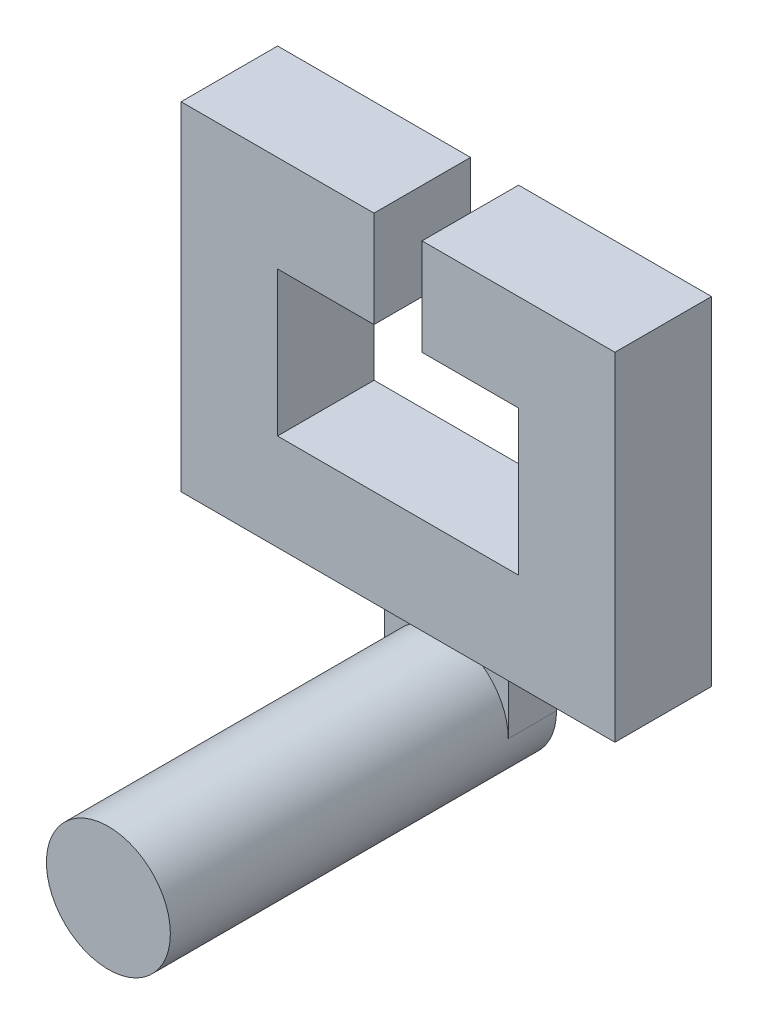
ISO-10303-21;
HEADER;
FILE_DESCRIPTION(('STEP AP214'),'2;1');
FILE_NAME('part.step','',(''),(''),'','','');
FILE_SCHEMA(('AUTOMOTIVE_DESIGN { 1 0 10303 214 1 1 1 1 }'));
ENDSEC;
DATA;
#1=APPLICATION_CONTEXT('core data for automotive mechanical design processes');
#2=APPLICATION_PROTOCOL_DEFINITION('international standard','automotive_design',2000,#1);
#3=PRODUCT_CONTEXT('',#1,'mechanical');
#4=PRODUCT('Part','Part','',(#3));
#5=PRODUCT_RELATED_PRODUCT_CATEGORY('part','',(#4));
#6=PRODUCT_DEFINITION_FORMATION('','',#4);
#7=PRODUCT_DEFINITION_CONTEXT('part definition',#1,'design');
#8=PRODUCT_DEFINITION('design','',#6,#7);
#9=PRODUCT_DEFINITION_SHAPE('','',#8);
#10=(LENGTH_UNIT() NAMED_UNIT(*) SI_UNIT(.MILLI.,.METRE.));
#11=(NAMED_UNIT(*) PLANE_ANGLE_UNIT() SI_UNIT($,.RADIAN.));
#12=(NAMED_UNIT(*) SI_UNIT($,.STERADIAN.) SOLID_ANGLE_UNIT());
#13=UNCERTAINTY_MEASURE_WITH_UNIT(LENGTH_MEASURE(1.E-05),#10,'distance_accuracy_value','');
#14=(GEOMETRIC_REPRESENTATION_CONTEXT(3) GLOBAL_UNCERTAINTY_ASSIGNED_CONTEXT((#13)) GLOBAL_UNIT_ASSIGNED_CONTEXT((#10,
#11,#12)) REPRESENTATION_CONTEXT('',''));
#15=CARTESIAN_POINT('',(0.,0.,0.));
#16=DIRECTION('',(0.,0.,1.));
#17=DIRECTION('',(1.,0.,0.));
#18=AXIS2_PLACEMENT_3D('',#15,#16,#17);
#19=CARTESIAN_POINT('',(0.,0.,101.6));
#20=DIRECTION('',(0.,0.,-1.));
#21=DIRECTION('',(-1.,0.,0.));
#22=AXIS2_PLACEMENT_3D('',#19,#20,#21);
#23=CYLINDRICAL_SURFACE('',#22,16.3068);
#24=CARTESIAN_POINT('',(0.,0.,101.6));
#25=DIRECTION('',(0.,0.,1.));
#26=DIRECTION('',(1.,0.,0.));
#27=AXIS2_PLACEMENT_3D('',#24,#25,#26);
#28=CIRCLE('',#27,16.3068);
#29=CARTESIAN_POINT('',(16.3068,0.,101.6));
#30=VERTEX_POINT('',#29);
#31=EDGE_CURVE('E63',#30,#30,#28,.T.);
#32=ORIENTED_EDGE('',*,*,#31,.F.);
#33=EDGE_LOOP('',(#32));
#34=FACE_BOUND('',#33,.T.);
#35=DIRECTION('',(0.,0.,-1.));
#36=VECTOR('',#35,1.);
#37=CARTESIAN_POINT('',(16.3068,0.,0.));
#38=LINE('',#37,#36);
#39=CARTESIAN_POINT('',(16.3068,0.,12.7));
#40=VERTEX_POINT('',#39);
#41=CARTESIAN_POINT('',(16.3068,0.,0.));
#42=VERTEX_POINT('',#41);
#43=EDGE_CURVE('E70',#40,#42,#38,.T.);
#44=ORIENTED_EDGE('',*,*,#43,.F.);
#45=CARTESIAN_POINT('',(0.,0.,12.7));
#46=DIRECTION('',(0.,0.,-1.));
#47=DIRECTION('',(-1.,0.,0.));
#48=AXIS2_PLACEMENT_3D('',#45,#46,#47);
#49=CIRCLE('',#48,16.3068);
#50=CARTESIAN_POINT('',(-16.3068,0.,12.7));
#51=VERTEX_POINT('',#50);
#52=EDGE_CURVE('E13',#51,#40,#49,.T.);
#53=ORIENTED_EDGE('',*,*,#52,.F.);
#54=DIRECTION('',(0.,0.,1.));
#55=VECTOR('',#54,1.);
#56=CARTESIAN_POINT('',(-16.3068,0.,0.));
#57=LINE('',#56,#55);
#58=CARTESIAN_POINT('',(-16.3068,0.,0.));
#59=VERTEX_POINT('',#58);
#60=EDGE_CURVE('E74',#59,#51,#57,.T.);
#61=ORIENTED_EDGE('',*,*,#60,.F.);
#62=CARTESIAN_POINT('',(0.,0.,0.));
#63=DIRECTION('',(0.,0.,1.));
#64=DIRECTION('',(1.,0.,0.));
#65=AXIS2_PLACEMENT_3D('',#62,#63,#64);
#66=CIRCLE('',#65,16.3068);
#67=EDGE_CURVE('E342',#59,#42,#66,.T.);
#68=ORIENTED_EDGE('',*,*,#67,.T.);
#69=EDGE_LOOP('',(#44,#53,#61,#68));
#70=FACE_BOUND('',#69,.T.);
#71=ADVANCED_FACE('F55',(#34,#70),#23,.T.);
#72=CARTESIAN_POINT('',(0.,0.,101.6));
#73=DIRECTION('',(0.,0.,1.));
#74=DIRECTION('',(1.,0.,0.));
#75=AXIS2_PLACEMENT_3D('',#72,#73,#74);
#76=PLANE('',#75);
#77=ORIENTED_EDGE('',*,*,#31,.T.);
#78=EDGE_LOOP('',(#77));
#79=FACE_BOUND('',#78,.T.);
#80=ADVANCED_FACE('F449',(#79),#76,.T.);
#81=CARTESIAN_POINT('',(0.,0.,0.));
#82=DIRECTION('',(0.,0.,1.));
#83=DIRECTION('',(1.,0.,0.));
#84=AXIS2_PLACEMENT_3D('',#81,#82,#83);
#85=PLANE('',#84);
#86=DIRECTION('',(-1.,0.,0.));
#87=VECTOR('',#86,1.);
#88=CARTESIAN_POINT('',(-31.6992,25.908,0.));
#89=LINE('',#88,#87);
#90=CARTESIAN_POINT('',(57.0738,25.908,0.));
#91=VERTEX_POINT('',#90);
#92=CARTESIAN_POINT('',(16.3068,25.908,0.));
#93=VERTEX_POINT('',#92);
#94=EDGE_CURVE('E293',#91,#93,#89,.T.);
#95=ORIENTED_EDGE('',*,*,#94,.T.);
#96=DIRECTION('',(0.,-1.,0.));
#97=VECTOR('',#96,1.);
#98=CARTESIAN_POINT('',(16.3068,25.908,0.));
#99=LINE('',#98,#97);
#100=EDGE_CURVE('E330',#93,#42,#99,.T.);
#101=ORIENTED_EDGE('',*,*,#100,.T.);
#102=ORIENTED_EDGE('',*,*,#67,.F.);
#103=DIRECTION('',(0.,-1.,0.));
#104=VECTOR('',#103,1.);
#105=CARTESIAN_POINT('',(-16.3068,25.908,0.));
#106=LINE('',#105,#104);
#107=CARTESIAN_POINT('',(-16.3068,25.908,0.));
#108=VERTEX_POINT('',#107);
#109=EDGE_CURVE('E322',#108,#59,#106,.T.);
#110=ORIENTED_EDGE('',*,*,#109,.F.);
#111=CARTESIAN_POINT('',(-57.0738,25.908,0.));
#112=VERTEX_POINT('',#111);
#113=EDGE_CURVE('E307',#108,#112,#89,.T.);
#114=ORIENTED_EDGE('',*,*,#113,.T.);
#115=DIRECTION('',(0.,1.,0.));
#116=VECTOR('',#115,1.);
#117=CARTESIAN_POINT('',(-57.0738,25.908,0.));
#118=LINE('',#117,#116);
#119=CARTESIAN_POINT('',(-57.0738,114.7826,0.));
#120=VERTEX_POINT('',#119);
#121=EDGE_CURVE('E178',#112,#120,#118,.T.);
#122=ORIENTED_EDGE('',*,*,#121,.T.);
#123=DIRECTION('',(1.,0.,0.));
#124=VECTOR('',#123,1.);
#125=CARTESIAN_POINT('',(-57.0738,114.7826,0.));
#126=LINE('',#125,#124);
#127=CARTESIAN_POINT('',(-6.31952,114.7826,0.));
#128=VERTEX_POINT('',#127);
#129=EDGE_CURVE('E188',#120,#128,#126,.T.);
#130=ORIENTED_EDGE('',*,*,#129,.T.);
#131=DIRECTION('',(0.,-1.,0.));
#132=VECTOR('',#131,1.);
#133=CARTESIAN_POINT('',(-6.31952,114.7826,0.));
#134=LINE('',#133,#132);
#135=CARTESIAN_POINT('',(-6.31952,89.3826,0.));
#136=VERTEX_POINT('',#135);
#137=EDGE_CURVE('E205',#128,#136,#134,.T.);
#138=ORIENTED_EDGE('',*,*,#137,.T.);
#139=DIRECTION('',(1.,0.,0.));
#140=VECTOR('',#139,1.);
#141=CARTESIAN_POINT('',(-57.0738,89.3826,0.));
#142=LINE('',#141,#140);
#143=CARTESIAN_POINT('',(-31.6992,89.3826,0.));
#144=VERTEX_POINT('',#143);
#145=EDGE_CURVE('E190',#144,#136,#142,.T.);
#146=ORIENTED_EDGE('',*,*,#145,.F.);
#147=DIRECTION('',(0.,1.,0.));
#148=VECTOR('',#147,1.);
#149=CARTESIAN_POINT('',(-31.6992,25.908,0.));
#150=LINE('',#149,#148);
#151=CARTESIAN_POINT('',(-31.6992,51.308,0.));
#152=VERTEX_POINT('',#151);
#153=EDGE_CURVE('E179',#152,#144,#150,.T.);
#154=ORIENTED_EDGE('',*,*,#153,.F.);
#155=DIRECTION('',(-1.,0.,0.));
#156=VECTOR('',#155,1.);
#157=CARTESIAN_POINT('',(-31.6992,51.308,0.));
#158=LINE('',#157,#156);
#159=CARTESIAN_POINT('',(31.6992,51.308,0.));
#160=VERTEX_POINT('',#159);
#161=EDGE_CURVE('E301',#160,#152,#158,.T.);
#162=ORIENTED_EDGE('',*,*,#161,.F.);
#163=DIRECTION('',(0.,1.,0.));
#164=VECTOR('',#163,1.);
#165=CARTESIAN_POINT('',(31.6992,25.908,0.));
#166=LINE('',#165,#164);
#167=CARTESIAN_POINT('',(31.6992,89.3826,0.));
#168=VERTEX_POINT('',#167);
#169=EDGE_CURVE('E282',#160,#168,#166,.T.);
#170=ORIENTED_EDGE('',*,*,#169,.T.);
#171=DIRECTION('',(-1.,0.,0.));
#172=VECTOR('',#171,1.);
#173=CARTESIAN_POINT('',(57.0738,89.3826,0.));
#174=LINE('',#173,#172);
#175=CARTESIAN_POINT('',(6.31952,89.3826,0.));
#176=VERTEX_POINT('',#175);
#177=EDGE_CURVE('E226',#168,#176,#174,.T.);
#178=ORIENTED_EDGE('',*,*,#177,.T.);
#179=DIRECTION('',(0.,-1.,0.));
#180=VECTOR('',#179,1.);
#181=CARTESIAN_POINT('',(6.31952,114.7826,0.));
#182=LINE('',#181,#180);
#183=CARTESIAN_POINT('',(6.31952,114.7826,0.));
#184=VERTEX_POINT('',#183);
#185=EDGE_CURVE('E262',#184,#176,#182,.T.);
#186=ORIENTED_EDGE('',*,*,#185,.F.);
#187=DIRECTION('',(-1.,0.,0.));
#188=VECTOR('',#187,1.);
#189=CARTESIAN_POINT('',(57.0738,114.7826,0.));
#190=LINE('',#189,#188);
#191=CARTESIAN_POINT('',(57.0738,114.7826,0.));
#192=VERTEX_POINT('',#191);
#193=EDGE_CURVE('E239',#192,#184,#190,.T.);
#194=ORIENTED_EDGE('',*,*,#193,.F.);
#195=DIRECTION('',(0.,1.,0.));
#196=VECTOR('',#195,1.);
#197=CARTESIAN_POINT('',(57.0738,25.908,0.));
#198=LINE('',#197,#196);
#199=EDGE_CURVE('E276',#91,#192,#198,.T.);
#200=ORIENTED_EDGE('',*,*,#199,.F.);
#201=EDGE_LOOP('',(#95,#101,#102,#110,#114,#122,#130,#138,#146,#154,#162,#170,#178,#186,#194,#200));
#202=FACE_BOUND('',#201,.T.);
#203=ADVANCED_FACE('F352',(#202),#85,.F.);
#204=CARTESIAN_POINT('',(-16.3068,25.908,0.));
#205=DIRECTION('',(1.,0.,0.));
#206=DIRECTION('',(0.,0.,-1.));
#207=AXIS2_PLACEMENT_3D('',#204,#205,#206);
#208=PLANE('',#207);
#209=ORIENTED_EDGE('',*,*,#60,.T.);
#210=DIRECTION('',(0.,-1.,0.));
#211=VECTOR('',#210,1.);
#212=CARTESIAN_POINT('',(-16.3068,25.908,12.7));
#213=LINE('',#212,#211);
#214=CARTESIAN_POINT('',(-16.3068,25.908,12.7));
#215=VERTEX_POINT('',#214);
#216=EDGE_CURVE('E338',#215,#51,#213,.T.);
#217=ORIENTED_EDGE('',*,*,#216,.F.);
#218=DIRECTION('',(0.,0.,1.));
#219=VECTOR('',#218,1.);
#220=CARTESIAN_POINT('',(-16.3068,25.908,0.));
#221=LINE('',#220,#219);
#222=EDGE_CURVE('E310',#108,#215,#221,.T.);
#223=ORIENTED_EDGE('',*,*,#222,.F.);
#224=ORIENTED_EDGE('',*,*,#109,.T.);
#225=EDGE_LOOP('',(#209,#217,#223,#224));
#226=FACE_BOUND('',#225,.T.);
#227=ADVANCED_FACE('F437',(#226),#208,.F.);
#228=CARTESIAN_POINT('',(-16.3068,25.908,12.7));
#229=DIRECTION('',(0.,0.,-1.));
#230=DIRECTION('',(-1.,0.,0.));
#231=AXIS2_PLACEMENT_3D('',#228,#229,#230);
#232=PLANE('',#231);
#233=ORIENTED_EDGE('',*,*,#216,.T.);
#234=ORIENTED_EDGE('',*,*,#52,.T.);
#235=DIRECTION('',(0.,-1.,0.));
#236=VECTOR('',#235,1.);
#237=CARTESIAN_POINT('',(16.3068,25.908,12.7));
#238=LINE('',#237,#236);
#239=CARTESIAN_POINT('',(16.3068,25.908,12.7));
#240=VERTEX_POINT('',#239);
#241=EDGE_CURVE('E334',#240,#40,#238,.T.);
#242=ORIENTED_EDGE('',*,*,#241,.F.);
#243=DIRECTION('',(1.,0.,0.));
#244=VECTOR('',#243,1.);
#245=CARTESIAN_POINT('',(-16.3068,25.908,12.7));
#246=LINE('',#245,#244);
#247=EDGE_CURVE('E314',#215,#240,#246,.T.);
#248=ORIENTED_EDGE('',*,*,#247,.F.);
#249=EDGE_LOOP('',(#233,#234,#242,#248));
#250=FACE_BOUND('',#249,.T.);
#251=ADVANCED_FACE('F439',(#250),#232,.F.);
#252=CARTESIAN_POINT('',(16.3068,25.908,0.));
#253=DIRECTION('',(-1.,0.,0.));
#254=DIRECTION('',(0.,0.,1.));
#255=AXIS2_PLACEMENT_3D('',#252,#253,#254);
#256=PLANE('',#255);
#257=ORIENTED_EDGE('',*,*,#43,.T.);
#258=ORIENTED_EDGE('',*,*,#100,.F.);
#259=DIRECTION('',(0.,0.,-1.));
#260=VECTOR('',#259,1.);
#261=CARTESIAN_POINT('',(16.3068,25.908,0.));
#262=LINE('',#261,#260);
#263=EDGE_CURVE('E318',#240,#93,#262,.T.);
#264=ORIENTED_EDGE('',*,*,#263,.F.);
#265=ORIENTED_EDGE('',*,*,#241,.T.);
#266=EDGE_LOOP('',(#257,#258,#264,#265));
#267=FACE_BOUND('',#266,.T.);
#268=ADVANCED_FACE('F350',(#267),#256,.F.);
#269=CARTESIAN_POINT('',(0.,25.908,0.));
#270=DIRECTION('',(0.,1.,0.));
#271=DIRECTION('',(0.,0.,1.));
#272=AXIS2_PLACEMENT_3D('',#269,#270,#271);
#273=PLANE('',#272);
#274=DIRECTION('',(0.,0.,-1.));
#275=VECTOR('',#274,1.);
#276=CARTESIAN_POINT('',(57.0738,25.908,25.4));
#277=LINE('',#276,#275);
#278=CARTESIAN_POINT('',(57.0738,25.908,25.4));
#279=VERTEX_POINT('',#278);
#280=EDGE_CURVE('E271',#279,#91,#277,.T.);
#281=ORIENTED_EDGE('',*,*,#280,.F.);
#282=DIRECTION('',(1.,0.,0.));
#283=VECTOR('',#282,1.);
#284=CARTESIAN_POINT('',(-31.6992,25.908,25.4));
#285=LINE('',#284,#283);
#286=CARTESIAN_POINT('',(-57.0738,25.908,25.4));
#287=VERTEX_POINT('',#286);
#288=EDGE_CURVE('E279',#287,#279,#285,.T.);
#289=ORIENTED_EDGE('',*,*,#288,.F.);
#290=DIRECTION('',(0.,0.,-1.));
#291=VECTOR('',#290,1.);
#292=CARTESIAN_POINT('',(-57.0738,25.908,25.4));
#293=LINE('',#292,#291);
#294=EDGE_CURVE('E174',#287,#112,#293,.T.);
#295=ORIENTED_EDGE('',*,*,#294,.T.);
#296=ORIENTED_EDGE('',*,*,#113,.F.);
#297=ORIENTED_EDGE('',*,*,#222,.T.);
#298=ORIENTED_EDGE('',*,*,#247,.T.);
#299=ORIENTED_EDGE('',*,*,#263,.T.);
#300=ORIENTED_EDGE('',*,*,#94,.F.);
#301=EDGE_LOOP('',(#281,#289,#295,#296,#297,#298,#299,#300));
#302=FACE_BOUND('',#301,.T.);
#303=ADVANCED_FACE('F357',(#302),#273,.F.);
#304=CARTESIAN_POINT('',(-31.6992,51.308,25.4));
#305=DIRECTION('',(0.,0.,-1.));
#306=DIRECTION('',(-1.,0.,0.));
#307=AXIS2_PLACEMENT_3D('',#304,#305,#306);
#308=PLANE('',#307);
#309=DIRECTION('',(0.,-1.,0.));
#310=VECTOR('',#309,1.);
#311=CARTESIAN_POINT('',(31.6992,25.908,25.4));
#312=LINE('',#311,#310);
#313=CARTESIAN_POINT('',(31.6992,89.3826,25.4));
#314=VERTEX_POINT('',#313);
#315=CARTESIAN_POINT('',(31.6992,51.308,25.4));
#316=VERTEX_POINT('',#315);
#317=EDGE_CURVE('E266',#314,#316,#312,.T.);
#318=ORIENTED_EDGE('',*,*,#317,.T.);
#319=DIRECTION('',(1.,0.,0.));
#320=VECTOR('',#319,1.);
#321=CARTESIAN_POINT('',(-31.6992,51.308,25.4));
#322=LINE('',#321,#320);
#323=CARTESIAN_POINT('',(-31.6992,51.308,25.4));
#324=VERTEX_POINT('',#323);
#325=EDGE_CURVE('E292',#324,#316,#322,.T.);
#326=ORIENTED_EDGE('',*,*,#325,.F.);
#327=DIRECTION('',(0.,-1.,0.));
#328=VECTOR('',#327,1.);
#329=CARTESIAN_POINT('',(-31.6992,25.908,25.4));
#330=LINE('',#329,#328);
#331=CARTESIAN_POINT('',(-31.6992,89.3826,25.4));
#332=VERTEX_POINT('',#331);
#333=EDGE_CURVE('E220',#332,#324,#330,.T.);
#334=ORIENTED_EDGE('',*,*,#333,.F.);
#335=DIRECTION('',(-1.,0.,0.));
#336=VECTOR('',#335,1.);
#337=CARTESIAN_POINT('',(-57.0738,89.3826,25.4));
#338=LINE('',#337,#336);
#339=CARTESIAN_POINT('',(-6.31952,89.3826,25.4));
#340=VERTEX_POINT('',#339);
#341=EDGE_CURVE('E206',#340,#332,#338,.T.);
#342=ORIENTED_EDGE('',*,*,#341,.F.);
#343=DIRECTION('',(0.,-1.,0.));
#344=VECTOR('',#343,1.);
#345=CARTESIAN_POINT('',(-6.31952,114.7826,25.4));
#346=LINE('',#345,#344);
#347=CARTESIAN_POINT('',(-6.31952,114.7826,25.4));
#348=VERTEX_POINT('',#347);
#349=EDGE_CURVE('E195',#348,#340,#346,.T.);
#350=ORIENTED_EDGE('',*,*,#349,.F.);
#351=DIRECTION('',(-1.,0.,0.));
#352=VECTOR('',#351,1.);
#353=CARTESIAN_POINT('',(-57.0738,114.7826,25.4));
#354=LINE('',#353,#352);
#355=CARTESIAN_POINT('',(-57.0738,114.7826,25.4));
#356=VERTEX_POINT('',#355);
#357=EDGE_CURVE('E185',#348,#356,#354,.T.);
#358=ORIENTED_EDGE('',*,*,#357,.T.);
#359=DIRECTION('',(0.,-1.,0.));
#360=VECTOR('',#359,1.);
#361=CARTESIAN_POINT('',(-57.0738,25.908,25.4));
#362=LINE('',#361,#360);
#363=EDGE_CURVE('E167',#356,#287,#362,.T.);
#364=ORIENTED_EDGE('',*,*,#363,.T.);
#365=ORIENTED_EDGE('',*,*,#288,.T.);
#366=DIRECTION('',(0.,-1.,0.));
#367=VECTOR('',#366,1.);
#368=CARTESIAN_POINT('',(57.0738,25.908,25.4));
#369=LINE('',#368,#367);
#370=CARTESIAN_POINT('',(57.0738,114.7826,25.4));
#371=VERTEX_POINT('',#370);
#372=EDGE_CURVE('E267',#371,#279,#369,.T.);
#373=ORIENTED_EDGE('',*,*,#372,.F.);
#374=DIRECTION('',(1.,0.,0.));
#375=VECTOR('',#374,1.);
#376=CARTESIAN_POINT('',(57.0738,114.7826,25.4));
#377=LINE('',#376,#375);
#378=CARTESIAN_POINT('',(6.31952,114.7826,25.4));
#379=VERTEX_POINT('',#378);
#380=EDGE_CURVE('E246',#379,#371,#377,.T.);
#381=ORIENTED_EDGE('',*,*,#380,.F.);
#382=DIRECTION('',(0.,-1.,0.));
#383=VECTOR('',#382,1.);
#384=CARTESIAN_POINT('',(6.31952,114.7826,25.4));
#385=LINE('',#384,#383);
#386=CARTESIAN_POINT('',(6.31952,89.3826,25.4));
#387=VERTEX_POINT('',#386);
#388=EDGE_CURVE('E250',#379,#387,#385,.T.);
#389=ORIENTED_EDGE('',*,*,#388,.T.);
#390=DIRECTION('',(1.,0.,0.));
#391=VECTOR('',#390,1.);
#392=CARTESIAN_POINT('',(57.0738,89.3826,25.4));
#393=LINE('',#392,#391);
#394=EDGE_CURVE('E240',#387,#314,#393,.T.);
#395=ORIENTED_EDGE('',*,*,#394,.T.);
#396=EDGE_LOOP('',(#318,#326,#334,#342,#350,#358,#364,#365,#373,#381,#389,#395));
#397=FACE_BOUND('',#396,.T.);
#398=ADVANCED_FACE('F193',(#397),#308,.F.);
#399=CARTESIAN_POINT('',(0.,51.308,0.));
#400=DIRECTION('',(0.,1.,0.));
#401=DIRECTION('',(0.,0.,1.));
#402=AXIS2_PLACEMENT_3D('',#399,#400,#401);
#403=PLANE('',#402);
#404=DIRECTION('',(0.,0.,1.));
#405=VECTOR('',#404,1.);
#406=CARTESIAN_POINT('',(-31.6992,51.308,0.));
#407=LINE('',#406,#405);
#408=EDGE_CURVE('E288',#152,#324,#407,.T.);
#409=ORIENTED_EDGE('',*,*,#408,.T.);
#410=ORIENTED_EDGE('',*,*,#325,.T.);
#411=DIRECTION('',(0.,0.,-1.));
#412=VECTOR('',#411,1.);
#413=CARTESIAN_POINT('',(31.6992,51.308,0.));
#414=LINE('',#413,#412);
#415=EDGE_CURVE('E297',#316,#160,#414,.T.);
#416=ORIENTED_EDGE('',*,*,#415,.T.);
#417=ORIENTED_EDGE('',*,*,#161,.T.);
#418=EDGE_LOOP('',(#409,#410,#416,#417));
#419=FACE_BOUND('',#418,.T.);
#420=ADVANCED_FACE('F379',(#419),#403,.T.);
#421=CARTESIAN_POINT('',(31.6992,0.,0.));
#422=DIRECTION('',(-1.,0.,0.));
#423=DIRECTION('',(0.,0.,1.));
#424=AXIS2_PLACEMENT_3D('',#421,#422,#423);
#425=PLANE('',#424);
#426=ORIENTED_EDGE('',*,*,#415,.F.);
#427=ORIENTED_EDGE('',*,*,#317,.F.);
#428=DIRECTION('',(0.,0.,1.));
#429=VECTOR('',#428,1.);
#430=CARTESIAN_POINT('',(31.6992,89.3826,25.4));
#431=LINE('',#430,#429);
#432=EDGE_CURVE('E272',#168,#314,#431,.T.);
#433=ORIENTED_EDGE('',*,*,#432,.F.);
#434=ORIENTED_EDGE('',*,*,#169,.F.);
#435=EDGE_LOOP('',(#426,#427,#433,#434));
#436=FACE_BOUND('',#435,.T.);
#437=ADVANCED_FACE('F376',(#436),#425,.T.);
#438=CARTESIAN_POINT('',(57.0738,0.,0.));
#439=DIRECTION('',(-1.,0.,0.));
#440=DIRECTION('',(0.,0.,1.));
#441=AXIS2_PLACEMENT_3D('',#438,#439,#440);
#442=PLANE('',#441);
#443=ORIENTED_EDGE('',*,*,#372,.T.);
#444=ORIENTED_EDGE('',*,*,#280,.T.);
#445=ORIENTED_EDGE('',*,*,#199,.T.);
#446=DIRECTION('',(0.,0.,-1.));
#447=VECTOR('',#446,1.);
#448=CARTESIAN_POINT('',(57.0738,114.7826,0.));
#449=LINE('',#448,#447);
#450=EDGE_CURVE('E235',#371,#192,#449,.T.);
#451=ORIENTED_EDGE('',*,*,#450,.F.);
#452=EDGE_LOOP('',(#443,#444,#445,#451));
#453=FACE_BOUND('',#452,.T.);
#454=ADVANCED_FACE('F359',(#453),#442,.F.);
#455=CARTESIAN_POINT('',(6.31952,114.7826,0.));
#456=DIRECTION('',(1.,0.,0.));
#457=DIRECTION('',(0.,0.,-1.));
#458=AXIS2_PLACEMENT_3D('',#455,#456,#457);
#459=PLANE('',#458);
#460=DIRECTION('',(0.,0.,1.));
#461=VECTOR('',#460,1.);
#462=CARTESIAN_POINT('',(6.31952,89.3826,0.));
#463=LINE('',#462,#461);
#464=EDGE_CURVE('E253',#176,#387,#463,.T.);
#465=ORIENTED_EDGE('',*,*,#464,.T.);
#466=ORIENTED_EDGE('',*,*,#388,.F.);
#467=DIRECTION('',(0.,0.,1.));
#468=VECTOR('',#467,1.);
#469=CARTESIAN_POINT('',(6.31952,114.7826,0.));
#470=LINE('',#469,#468);
#471=EDGE_CURVE('E243',#184,#379,#470,.T.);
#472=ORIENTED_EDGE('',*,*,#471,.F.);
#473=ORIENTED_EDGE('',*,*,#185,.T.);
#474=EDGE_LOOP('',(#465,#466,#472,#473));
#475=FACE_BOUND('',#474,.T.);
#476=ADVANCED_FACE('F368',(#475),#459,.F.);
#477=CARTESIAN_POINT('',(0.,114.7826,0.));
#478=DIRECTION('',(0.,-1.,0.));
#479=DIRECTION('',(0.,0.,-1.));
#480=AXIS2_PLACEMENT_3D('',#477,#478,#479);
#481=PLANE('',#480);
#482=ORIENTED_EDGE('',*,*,#450,.T.);
#483=ORIENTED_EDGE('',*,*,#193,.T.);
#484=ORIENTED_EDGE('',*,*,#471,.T.);
#485=ORIENTED_EDGE('',*,*,#380,.T.);
#486=EDGE_LOOP('',(#482,#483,#484,#485));
#487=FACE_BOUND('',#486,.T.);
#488=ADVANCED_FACE('F363',(#487),#481,.F.);
#489=CARTESIAN_POINT('',(0.,89.3826,0.));
#490=DIRECTION('',(0.,-1.,0.));
#491=DIRECTION('',(0.,0.,-1.));
#492=AXIS2_PLACEMENT_3D('',#489,#490,#491);
#493=PLANE('',#492);
#494=ORIENTED_EDGE('',*,*,#177,.F.);
#495=ORIENTED_EDGE('',*,*,#432,.T.);
#496=ORIENTED_EDGE('',*,*,#394,.F.);
#497=ORIENTED_EDGE('',*,*,#464,.F.);
#498=EDGE_LOOP('',(#494,#495,#496,#497));
#499=FACE_BOUND('',#498,.T.);
#500=ADVANCED_FACE('F373',(#499),#493,.T.);
#501=CARTESIAN_POINT('',(-31.6992,0.,0.));
#502=DIRECTION('',(1.,0.,0.));
#503=DIRECTION('',(0.,0.,1.));
#504=AXIS2_PLACEMENT_3D('',#501,#502,#503);
#505=PLANE('',#504);
#506=ORIENTED_EDGE('',*,*,#408,.F.);
#507=ORIENTED_EDGE('',*,*,#153,.T.);
#508=DIRECTION('',(0.,0.,1.));
#509=VECTOR('',#508,1.);
#510=CARTESIAN_POINT('',(-31.6992,89.3826,25.4));
#511=LINE('',#510,#509);
#512=EDGE_CURVE('E229',#144,#332,#511,.T.);
#513=ORIENTED_EDGE('',*,*,#512,.T.);
#514=ORIENTED_EDGE('',*,*,#333,.T.);
#515=EDGE_LOOP('',(#506,#507,#513,#514));
#516=FACE_BOUND('',#515,.T.);
#517=ADVANCED_FACE('F383',(#516),#505,.T.);
#518=CARTESIAN_POINT('',(-57.0738,0.,0.));
#519=DIRECTION('',(1.,0.,0.));
#520=DIRECTION('',(0.,0.,1.));
#521=AXIS2_PLACEMENT_3D('',#518,#519,#520);
#522=PLANE('',#521);
#523=ORIENTED_EDGE('',*,*,#363,.F.);
#524=DIRECTION('',(0.,0.,-1.));
#525=VECTOR('',#524,1.);
#526=CARTESIAN_POINT('',(-57.0738,114.7826,0.));
#527=LINE('',#526,#525);
#528=EDGE_CURVE('E171',#356,#120,#527,.T.);
#529=ORIENTED_EDGE('',*,*,#528,.T.);
#530=ORIENTED_EDGE('',*,*,#121,.F.);
#531=ORIENTED_EDGE('',*,*,#294,.F.);
#532=EDGE_LOOP('',(#523,#529,#530,#531));
#533=FACE_BOUND('',#532,.T.);
#534=ADVANCED_FACE('F169',(#533),#522,.F.);
#535=CARTESIAN_POINT('',(-6.31952,114.7826,0.));
#536=DIRECTION('',(1.,0.,0.));
#537=DIRECTION('',(0.,0.,-1.));
#538=AXIS2_PLACEMENT_3D('',#535,#536,#537);
#539=PLANE('',#538);
#540=DIRECTION('',(0.,0.,1.));
#541=VECTOR('',#540,1.);
#542=CARTESIAN_POINT('',(-6.31952,89.3826,0.));
#543=LINE('',#542,#541);
#544=EDGE_CURVE('E210',#136,#340,#543,.T.);
#545=ORIENTED_EDGE('',*,*,#544,.F.);
#546=ORIENTED_EDGE('',*,*,#137,.F.);
#547=DIRECTION('',(0.,0.,1.));
#548=VECTOR('',#547,1.);
#549=CARTESIAN_POINT('',(-6.31952,114.7826,0.));
#550=LINE('',#549,#548);
#551=EDGE_CURVE('E197',#128,#348,#550,.T.);
#552=ORIENTED_EDGE('',*,*,#551,.T.);
#553=ORIENTED_EDGE('',*,*,#349,.T.);
#554=EDGE_LOOP('',(#545,#546,#552,#553));
#555=FACE_BOUND('',#554,.T.);
#556=ADVANCED_FACE('F390',(#555),#539,.T.);
#557=CARTESIAN_POINT('',(0.,114.7826,0.));
#558=DIRECTION('',(0.,-1.,0.));
#559=DIRECTION('',(0.,0.,-1.));
#560=AXIS2_PLACEMENT_3D('',#557,#558,#559);
#561=PLANE('',#560);
#562=ORIENTED_EDGE('',*,*,#528,.F.);
#563=ORIENTED_EDGE('',*,*,#357,.F.);
#564=ORIENTED_EDGE('',*,*,#551,.F.);
#565=ORIENTED_EDGE('',*,*,#129,.F.);
#566=EDGE_LOOP('',(#562,#563,#564,#565));
#567=FACE_BOUND('',#566,.T.);
#568=ADVANCED_FACE('F183',(#567),#561,.F.);
#569=CARTESIAN_POINT('',(0.,89.3826,0.));
#570=DIRECTION('',(0.,-1.,0.));
#571=DIRECTION('',(0.,0.,-1.));
#572=AXIS2_PLACEMENT_3D('',#569,#570,#571);
#573=PLANE('',#572);
#574=ORIENTED_EDGE('',*,*,#341,.T.);
#575=ORIENTED_EDGE('',*,*,#512,.F.);
#576=ORIENTED_EDGE('',*,*,#145,.T.);
#577=ORIENTED_EDGE('',*,*,#544,.T.);
#578=EDGE_LOOP('',(#574,#575,#576,#577));
#579=FACE_BOUND('',#578,.T.);
#580=ADVANCED_FACE('F388',(#579),#573,.T.);
#581=CLOSED_SHELL('',(#71,#80,#203,#227,#251,#268,#303,#398,#420,#437,#454,#476,#488,#500,#517,
#534,#556,#568,#580));
#582=MANIFOLD_SOLID_BREP('B2',#581);
#583=ADVANCED_BREP_SHAPE_REPRESENTATION('',(#18,#582),#14);
#584=SHAPE_DEFINITION_REPRESENTATION(#9,#583);
ENDSEC;
END-ISO-10303-21;
